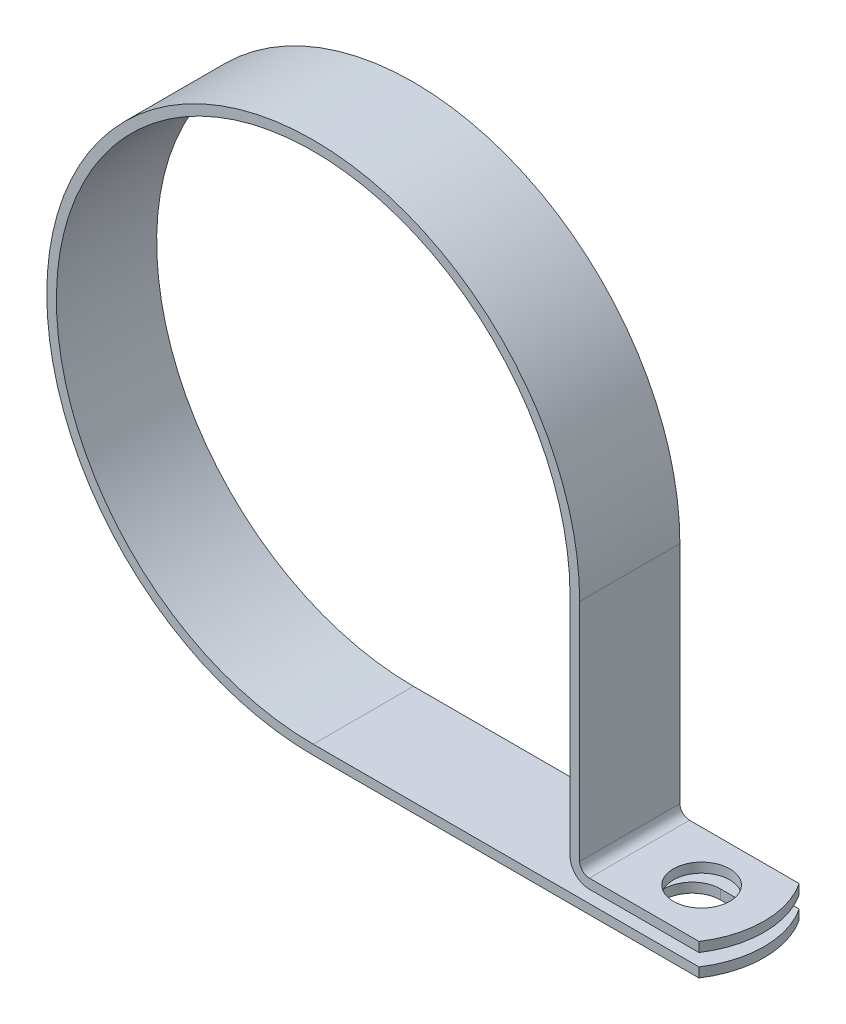
ISO-10303-21;
HEADER;
FILE_DESCRIPTION(('STEP AP214'),'2;1');
FILE_NAME('part.step','',(''),(''),'','','');
FILE_SCHEMA(('AUTOMOTIVE_DESIGN { 1 0 10303 214 1 1 1 1 }'));
ENDSEC;
DATA;
#1=APPLICATION_CONTEXT('core data for automotive mechanical design processes');
#2=APPLICATION_PROTOCOL_DEFINITION('international standard','automotive_design',2000,#1);
#3=PRODUCT_CONTEXT('',#1,'mechanical');
#4=PRODUCT('Part','Part','',(#3));
#5=PRODUCT_RELATED_PRODUCT_CATEGORY('part','',(#4));
#6=PRODUCT_DEFINITION_FORMATION('','',#4);
#7=PRODUCT_DEFINITION_CONTEXT('part definition',#1,'design');
#8=PRODUCT_DEFINITION('design','',#6,#7);
#9=PRODUCT_DEFINITION_SHAPE('','',#8);
#10=(LENGTH_UNIT() NAMED_UNIT(*) SI_UNIT(.MILLI.,.METRE.));
#11=(NAMED_UNIT(*) PLANE_ANGLE_UNIT() SI_UNIT($,.RADIAN.));
#12=(NAMED_UNIT(*) SI_UNIT($,.STERADIAN.) SOLID_ANGLE_UNIT());
#13=UNCERTAINTY_MEASURE_WITH_UNIT(LENGTH_MEASURE(1.E-05),#10,'distance_accuracy_value','');
#14=(GEOMETRIC_REPRESENTATION_CONTEXT(3) GLOBAL_UNCERTAINTY_ASSIGNED_CONTEXT((#13)) GLOBAL_UNIT_ASSIGNED_CONTEXT((#10,
#11,#12)) REPRESENTATION_CONTEXT('',''));
#15=CARTESIAN_POINT('',(0.,0.,0.));
#16=DIRECTION('',(0.,0.,1.));
#17=DIRECTION('',(1.,0.,0.));
#18=AXIS2_PLACEMENT_3D('',#15,#16,#17);
#19=CARTESIAN_POINT('',(39.2514666666582,174.896848604333,0.));
#20=DIRECTION('',(0.,-1.,0.));
#21=DIRECTION('',(0.,0.,-1.));
#22=AXIS2_PLACEMENT_3D('',#19,#20,#21);
#23=CYLINDRICAL_SURFACE('',#22,11.5358333333342);
#24=DIRECTION('',(0.,-1.,0.));
#25=VECTOR('',#24,1.);
#26=CARTESIAN_POINT('',(48.8822999999948,174.896848604333,-6.34999999999657));
#27=LINE('',#26,#25);
#28=CARTESIAN_POINT('',(48.8822999999937,-30.96895,-6.34999999999829));
#29=VERTEX_POINT('',#28);
#30=CARTESIAN_POINT('',(48.8822999999937,-29.74975,-6.34999999999829));
#31=VERTEX_POINT('',#30);
#32=EDGE_CURVE('E126',#29,#31,#27,.F.);
#33=ORIENTED_EDGE('',*,*,#32,.T.);
#34=CARTESIAN_POINT('',(39.2514666666582,-29.74975,0.));
#35=DIRECTION('',(0.,-1.,0.));
#36=DIRECTION('',(0.,0.,-1.));
#37=AXIS2_PLACEMENT_3D('',#34,#35,#36);
#38=CIRCLE('',#37,11.5358333333342);
#39=CARTESIAN_POINT('',(48.8822999999937,-29.74975,6.34999999999829));
#40=VERTEX_POINT('',#39);
#41=EDGE_CURVE('E19',#31,#40,#38,.T.);
#42=ORIENTED_EDGE('',*,*,#41,.T.);
#43=DIRECTION('',(0.,-1.,0.));
#44=VECTOR('',#43,1.);
#45=CARTESIAN_POINT('',(48.8822999999948,174.896848604333,6.34999999999658));
#46=LINE('',#45,#44);
#47=CARTESIAN_POINT('',(48.8822999999937,-30.96895,6.34999999999829));
#48=VERTEX_POINT('',#47);
#49=EDGE_CURVE('E134',#40,#48,#46,.T.);
#50=ORIENTED_EDGE('',*,*,#49,.T.);
#51=CARTESIAN_POINT('',(39.2514666666582,-30.96895,0.));
#52=DIRECTION('',(0.,-1.,0.));
#53=DIRECTION('',(0.,0.,-1.));
#54=AXIS2_PLACEMENT_3D('',#51,#52,#53);
#55=CIRCLE('',#54,11.5358333333342);
#56=EDGE_CURVE('E130',#48,#29,#55,.F.);
#57=ORIENTED_EDGE('',*,*,#56,.T.);
#58=EDGE_LOOP('',(#33,#42,#50,#57));
#59=FACE_BOUND('',#58,.T.);
#60=ADVANCED_FACE('F16',(#59),#23,.T.);
#61=CARTESIAN_POINT('',(42.8625,-33.76295,0.));
#62=DIRECTION('',(0.,1.,0.));
#63=DIRECTION('',(0.,0.,1.));
#64=AXIS2_PLACEMENT_3D('',#61,#62,#63);
#65=CYLINDRICAL_SURFACE('',#64,3.571875);
#66=CARTESIAN_POINT('',(42.8625,-29.74975,0.));
#67=DIRECTION('',(0.,1.,0.));
#68=DIRECTION('',(0.,0.,1.));
#69=AXIS2_PLACEMENT_3D('',#66,#67,#68);
#70=CIRCLE('',#69,3.571875);
#71=CARTESIAN_POINT('',(42.8625,-29.74975,3.571875));
#72=VERTEX_POINT('',#71);
#73=EDGE_CURVE('E142',#72,#72,#70,.T.);
#74=ORIENTED_EDGE('',*,*,#73,.T.);
#75=EDGE_LOOP('',(#74));
#76=FACE_BOUND('',#75,.T.);
#77=CARTESIAN_POINT('',(42.8625,-30.96895,0.));
#78=DIRECTION('',(0.,1.,0.));
#79=DIRECTION('',(0.,0.,1.));
#80=AXIS2_PLACEMENT_3D('',#77,#78,#79);
#81=CIRCLE('',#80,3.571875);
#82=CARTESIAN_POINT('',(42.8625,-30.96895,3.571875));
#83=VERTEX_POINT('',#82);
#84=EDGE_CURVE('E205',#83,#83,#81,.F.);
#85=ORIENTED_EDGE('',*,*,#84,.T.);
#86=EDGE_LOOP('',(#85));
#87=FACE_BOUND('',#86,.T.);
#88=ADVANCED_FACE('F244',(#76,#87),#65,.F.);
#89=CARTESIAN_POINT('',(34.98215,-29.74975,6.35));
#90=DIRECTION('',(0.,-1.,0.));
#91=DIRECTION('',(0.,0.,-1.));
#92=AXIS2_PLACEMENT_3D('',#89,#90,#91);
#93=PLANE('',#92);
#94=ORIENTED_EDGE('',*,*,#73,.F.);
#95=EDGE_LOOP('',(#94));
#96=FACE_BOUND('',#95,.T.);
#97=DIRECTION('',(-1.,0.,0.));
#98=VECTOR('',#97,1.);
#99=CARTESIAN_POINT('',(34.98215,-29.74975,-6.35));
#100=LINE('',#99,#98);
#101=CARTESIAN_POINT('',(34.98215,-29.74975,-6.35));
#102=VERTEX_POINT('',#101);
#103=EDGE_CURVE('E138',#102,#31,#100,.F.);
#104=ORIENTED_EDGE('',*,*,#103,.F.);
#105=DIRECTION('',(0.,0.,-1.));
#106=VECTOR('',#105,1.);
#107=CARTESIAN_POINT('',(34.98215,-29.74975,6.35));
#108=LINE('',#107,#106);
#109=CARTESIAN_POINT('',(34.98215,-29.74975,6.35));
#110=VERTEX_POINT('',#109);
#111=EDGE_CURVE('E192',#102,#110,#108,.F.);
#112=ORIENTED_EDGE('',*,*,#111,.T.);
#113=DIRECTION('',(-1.,0.,0.));
#114=VECTOR('',#113,1.);
#115=CARTESIAN_POINT('',(34.98215,-29.74975,6.35));
#116=LINE('',#115,#114);
#117=EDGE_CURVE('E141',#110,#40,#116,.F.);
#118=ORIENTED_EDGE('',*,*,#117,.T.);
#119=ORIENTED_EDGE('',*,*,#41,.F.);
#120=EDGE_LOOP('',(#104,#112,#118,#119));
#121=FACE_BOUND('',#120,.T.);
#122=ADVANCED_FACE('F137',(#96,#121),#93,.F.);
#123=CARTESIAN_POINT('',(34.98215,-30.96895,6.35));
#124=DIRECTION('',(0.,1.,0.));
#125=DIRECTION('',(0.,0.,1.));
#126=AXIS2_PLACEMENT_3D('',#123,#124,#125);
#127=PLANE('',#126);
#128=ORIENTED_EDGE('',*,*,#84,.F.);
#129=EDGE_LOOP('',(#128));
#130=FACE_BOUND('',#129,.T.);
#131=DIRECTION('',(-1.,0.,0.));
#132=VECTOR('',#131,1.);
#133=CARTESIAN_POINT('',(34.98215,-30.96895,6.35));
#134=LINE('',#133,#132);
#135=CARTESIAN_POINT('',(34.98215,-30.96895,6.35));
#136=VERTEX_POINT('',#135);
#137=EDGE_CURVE('E170',#48,#136,#134,.T.);
#138=ORIENTED_EDGE('',*,*,#137,.T.);
#139=DIRECTION('',(0.,0.,-1.));
#140=VECTOR('',#139,1.);
#141=CARTESIAN_POINT('',(34.98215,-30.96895,6.35));
#142=LINE('',#141,#140);
#143=CARTESIAN_POINT('',(34.98215,-30.96895,-6.35));
#144=VERTEX_POINT('',#143);
#145=EDGE_CURVE('E202',#144,#136,#142,.F.);
#146=ORIENTED_EDGE('',*,*,#145,.F.);
#147=DIRECTION('',(-1.,0.,0.));
#148=VECTOR('',#147,1.);
#149=CARTESIAN_POINT('',(34.98215,-30.96895,-6.35));
#150=LINE('',#149,#148);
#151=EDGE_CURVE('E148',#29,#144,#150,.T.);
#152=ORIENTED_EDGE('',*,*,#151,.F.);
#153=ORIENTED_EDGE('',*,*,#56,.F.);
#154=EDGE_LOOP('',(#138,#146,#152,#153));
#155=FACE_BOUND('',#154,.T.);
#156=ADVANCED_FACE('F248',(#130,#155),#127,.F.);
#157=CARTESIAN_POINT('',(34.98215,-28.53055,6.35));
#158=DIRECTION('',(0.,0.,-1.));
#159=DIRECTION('',(-1.,0.,0.));
#160=AXIS2_PLACEMENT_3D('',#157,#158,#159);
#161=CYLINDRICAL_SURFACE('',#160,2.4384);
#162=CARTESIAN_POINT('',(34.98215,-28.53055,6.35));
#163=DIRECTION('',(0.,0.,-1.));
#164=DIRECTION('',(-1.,0.,0.));
#165=AXIS2_PLACEMENT_3D('',#162,#163,#164);
#166=CIRCLE('',#165,2.4384);
#167=CARTESIAN_POINT('',(32.54375,-28.53055,6.35));
#168=VERTEX_POINT('',#167);
#169=EDGE_CURVE('E169',#136,#168,#166,.T.);
#170=ORIENTED_EDGE('',*,*,#169,.T.);
#171=DIRECTION('',(0.,0.,-1.));
#172=VECTOR('',#171,1.);
#173=CARTESIAN_POINT('',(32.54375,-28.53055,6.35));
#174=LINE('',#173,#172);
#175=CARTESIAN_POINT('',(32.54375,-28.53055,-6.35));
#176=VERTEX_POINT('',#175);
#177=EDGE_CURVE('E200',#168,#176,#174,.T.);
#178=ORIENTED_EDGE('',*,*,#177,.T.);
#179=CARTESIAN_POINT('',(34.98215,-28.53055,-6.35));
#180=DIRECTION('',(0.,0.,-1.));
#181=DIRECTION('',(-1.,0.,0.));
#182=AXIS2_PLACEMENT_3D('',#179,#180,#181);
#183=CIRCLE('',#182,2.4384);
#184=EDGE_CURVE('E151',#144,#176,#183,.T.);
#185=ORIENTED_EDGE('',*,*,#184,.F.);
#186=ORIENTED_EDGE('',*,*,#145,.T.);
#187=EDGE_LOOP('',(#170,#178,#185,#186));
#188=FACE_BOUND('',#187,.T.);
#189=ADVANCED_FACE('F255',(#188),#161,.T.);
#190=CARTESIAN_POINT('',(32.54375,0.,6.35));
#191=DIRECTION('',(1.,0.,0.));
#192=DIRECTION('',(0.,0.,-1.));
#193=AXIS2_PLACEMENT_3D('',#190,#191,#192);
#194=PLANE('',#193);
#195=ORIENTED_EDGE('',*,*,#177,.F.);
#196=DIRECTION('',(0.,1.,0.));
#197=VECTOR('',#196,1.);
#198=CARTESIAN_POINT('',(32.54375,-28.53055,6.35));
#199=LINE('',#198,#197);
#200=CARTESIAN_POINT('',(32.54375,0.,6.35));
#201=VERTEX_POINT('',#200);
#202=EDGE_CURVE('E167',#168,#201,#199,.T.);
#203=ORIENTED_EDGE('',*,*,#202,.T.);
#204=DIRECTION('',(0.,0.,-1.));
#205=VECTOR('',#204,1.);
#206=CARTESIAN_POINT('',(32.54375,0.,6.35));
#207=LINE('',#206,#205);
#208=CARTESIAN_POINT('',(32.54375,0.,-6.35));
#209=VERTEX_POINT('',#208);
#210=EDGE_CURVE('E198',#201,#209,#207,.T.);
#211=ORIENTED_EDGE('',*,*,#210,.T.);
#212=DIRECTION('',(0.,1.,0.));
#213=VECTOR('',#212,1.);
#214=CARTESIAN_POINT('',(32.54375,-28.53055,-6.35));
#215=LINE('',#214,#213);
#216=EDGE_CURVE('E228',#176,#209,#215,.T.);
#217=ORIENTED_EDGE('',*,*,#216,.F.);
#218=EDGE_LOOP('',(#195,#203,#211,#217));
#219=FACE_BOUND('',#218,.T.);
#220=ADVANCED_FACE('F310',(#219),#194,.F.);
#221=CARTESIAN_POINT('',(0.,0.,6.35));
#222=DIRECTION('',(0.,0.,-1.));
#223=DIRECTION('',(-1.,0.,0.));
#224=AXIS2_PLACEMENT_3D('',#221,#222,#223);
#225=CYLINDRICAL_SURFACE('',#224,32.54375);
#226=DIRECTION('',(0.,0.,-1.));
#227=VECTOR('',#226,1.);
#228=CARTESIAN_POINT('',(0.,-32.54375,6.35));
#229=LINE('',#228,#227);
#230=CARTESIAN_POINT('',(0.,-32.54375,6.35));
#231=VERTEX_POINT('',#230);
#232=CARTESIAN_POINT('',(0.,-32.54375,-6.35));
#233=VERTEX_POINT('',#232);
#234=EDGE_CURVE('E195',#231,#233,#229,.T.);
#235=ORIENTED_EDGE('',*,*,#234,.T.);
#236=CARTESIAN_POINT('',(0.,0.,-6.35));
#237=DIRECTION('',(0.,0.,-1.));
#238=DIRECTION('',(-1.,0.,0.));
#239=AXIS2_PLACEMENT_3D('',#236,#237,#238);
#240=CIRCLE('',#239,32.54375);
#241=EDGE_CURVE('E225',#209,#233,#240,.F.);
#242=ORIENTED_EDGE('',*,*,#241,.F.);
#243=ORIENTED_EDGE('',*,*,#210,.F.);
#244=CARTESIAN_POINT('',(0.,0.,6.35));
#245=DIRECTION('',(0.,0.,-1.));
#246=DIRECTION('',(-1.,0.,0.));
#247=AXIS2_PLACEMENT_3D('',#244,#245,#246);
#248=CIRCLE('',#247,32.54375);
#249=EDGE_CURVE('E166',#201,#231,#248,.F.);
#250=ORIENTED_EDGE('',*,*,#249,.T.);
#251=EDGE_LOOP('',(#235,#242,#243,#250));
#252=FACE_BOUND('',#251,.T.);
#253=ADVANCED_FACE('F306',(#252),#225,.F.);
#254=CARTESIAN_POINT('',(0.,-32.54375,6.35));
#255=DIRECTION('',(0.,-1.,0.));
#256=DIRECTION('',(0.,0.,-1.));
#257=AXIS2_PLACEMENT_3D('',#254,#255,#256);
#258=PLANE('',#257);
#259=DIRECTION('',(1.,0.,0.));
#260=VECTOR('',#259,1.);
#261=CARTESIAN_POINT('',(41.671875,-32.54375,3.571875));
#262=LINE('',#261,#260);
#263=CARTESIAN_POINT('',(44.053125,-32.54375,3.571875));
#264=VERTEX_POINT('',#263);
#265=CARTESIAN_POINT('',(41.671875,-32.54375,3.571875));
#266=VERTEX_POINT('',#265);
#267=EDGE_CURVE('E182',#264,#266,#262,.F.);
#268=ORIENTED_EDGE('',*,*,#267,.T.);
#269=CARTESIAN_POINT('',(41.671875,-32.54375,0.));
#270=DIRECTION('',(0.,-1.,0.));
#271=DIRECTION('',(0.,0.,-1.));
#272=AXIS2_PLACEMENT_3D('',#269,#270,#271);
#273=CIRCLE('',#272,3.571875);
#274=CARTESIAN_POINT('',(41.671875,-32.54375,-3.571875));
#275=VERTEX_POINT('',#274);
#276=EDGE_CURVE('E178',#266,#275,#273,.T.);
#277=ORIENTED_EDGE('',*,*,#276,.T.);
#278=DIRECTION('',(-1.,0.,0.));
#279=VECTOR('',#278,1.);
#280=CARTESIAN_POINT('',(41.671875,-32.54375,-3.571875));
#281=LINE('',#280,#279);
#282=CARTESIAN_POINT('',(44.053125,-32.54375,-3.571875));
#283=VERTEX_POINT('',#282);
#284=EDGE_CURVE('E172',#275,#283,#281,.F.);
#285=ORIENTED_EDGE('',*,*,#284,.T.);
#286=CARTESIAN_POINT('',(44.053125,-32.54375,0.));
#287=DIRECTION('',(0.,-1.,0.));
#288=DIRECTION('',(0.,0.,-1.));
#289=AXIS2_PLACEMENT_3D('',#286,#287,#288);
#290=CIRCLE('',#289,3.571875);
#291=EDGE_CURVE('E186',#283,#264,#290,.T.);
#292=ORIENTED_EDGE('',*,*,#291,.T.);
#293=EDGE_LOOP('',(#268,#277,#285,#292));
#294=FACE_BOUND('',#293,.T.);
#295=DIRECTION('',(-1.,0.,0.));
#296=VECTOR('',#295,1.);
#297=CARTESIAN_POINT('',(34.98215,-32.54375,-6.35));
#298=LINE('',#297,#296);
#299=CARTESIAN_POINT('',(48.8822999999963,-32.54375,-6.35));
#300=VERTEX_POINT('',#299);
#301=EDGE_CURVE('E191',#233,#300,#298,.F.);
#302=ORIENTED_EDGE('',*,*,#301,.F.);
#303=ORIENTED_EDGE('',*,*,#234,.F.);
#304=DIRECTION('',(-1.,0.,0.));
#305=VECTOR('',#304,1.);
#306=CARTESIAN_POINT('',(34.98215,-32.54375,6.35));
#307=LINE('',#306,#305);
#308=CARTESIAN_POINT('',(48.8822999999963,-32.54375,6.35));
#309=VERTEX_POINT('',#308);
#310=EDGE_CURVE('E163',#231,#309,#307,.F.);
#311=ORIENTED_EDGE('',*,*,#310,.T.);
#312=CARTESIAN_POINT('',(39.2514666666582,-32.54375,0.));
#313=DIRECTION('',(0.,-1.,0.));
#314=DIRECTION('',(0.,0.,-1.));
#315=AXIS2_PLACEMENT_3D('',#312,#313,#314);
#316=CIRCLE('',#315,11.5358333333342);
#317=EDGE_CURVE('E194',#300,#309,#316,.T.);
#318=ORIENTED_EDGE('',*,*,#317,.F.);
#319=EDGE_LOOP('',(#302,#303,#311,#318));
#320=FACE_BOUND('',#319,.T.);
#321=ADVANCED_FACE('F302',(#294,#320),#258,.F.);
#322=CARTESIAN_POINT('',(34.98215,-28.53055,6.35));
#323=DIRECTION('',(0.,0.,-1.));
#324=DIRECTION('',(-1.,0.,0.));
#325=AXIS2_PLACEMENT_3D('',#322,#323,#324);
#326=CYLINDRICAL_SURFACE('',#325,1.2192);
#327=DIRECTION('',(0.,0.,1.));
#328=VECTOR('',#327,1.);
#329=CARTESIAN_POINT('',(33.76295,-28.53055,6.35));
#330=LINE('',#329,#328);
#331=CARTESIAN_POINT('',(33.76295,-28.53055,-6.35));
#332=VERTEX_POINT('',#331);
#333=CARTESIAN_POINT('',(33.76295,-28.53055,6.35));
#334=VERTEX_POINT('',#333);
#335=EDGE_CURVE('E153',#332,#334,#330,.T.);
#336=ORIENTED_EDGE('',*,*,#335,.T.);
#337=CARTESIAN_POINT('',(34.98215,-28.53055,6.35));
#338=DIRECTION('',(0.,0.,-1.));
#339=DIRECTION('',(-1.,0.,0.));
#340=AXIS2_PLACEMENT_3D('',#337,#338,#339);
#341=CIRCLE('',#340,1.2192);
#342=EDGE_CURVE('E162',#334,#110,#341,.F.);
#343=ORIENTED_EDGE('',*,*,#342,.T.);
#344=ORIENTED_EDGE('',*,*,#111,.F.);
#345=CARTESIAN_POINT('',(34.98215,-28.53055,-6.35));
#346=DIRECTION('',(0.,0.,-1.));
#347=DIRECTION('',(-1.,0.,0.));
#348=AXIS2_PLACEMENT_3D('',#345,#346,#347);
#349=CIRCLE('',#348,1.2192);
#350=EDGE_CURVE('E147',#332,#102,#349,.F.);
#351=ORIENTED_EDGE('',*,*,#350,.F.);
#352=EDGE_LOOP('',(#336,#343,#344,#351));
#353=FACE_BOUND('',#352,.T.);
#354=ADVANCED_FACE('F298',(#353),#326,.F.);
#355=CARTESIAN_POINT('',(39.2514666666582,174.896848604333,0.));
#356=DIRECTION('',(0.,-1.,0.));
#357=DIRECTION('',(0.,0.,-1.));
#358=AXIS2_PLACEMENT_3D('',#355,#356,#357);
#359=CYLINDRICAL_SURFACE('',#358,11.5358333333342);
#360=DIRECTION('',(0.,1.,0.));
#361=VECTOR('',#360,1.);
#362=CARTESIAN_POINT('',(48.8823,-28.53055,-6.35));
#363=LINE('',#362,#361);
#364=CARTESIAN_POINT('',(48.8822999999963,-33.76295,-6.35));
#365=VERTEX_POINT('',#364);
#366=EDGE_CURVE('E188',#300,#365,#363,.F.);
#367=ORIENTED_EDGE('',*,*,#366,.F.);
#368=ORIENTED_EDGE('',*,*,#317,.T.);
#369=DIRECTION('',(0.,1.,0.));
#370=VECTOR('',#369,1.);
#371=CARTESIAN_POINT('',(48.8823,-28.53055,6.35));
#372=LINE('',#371,#370);
#373=CARTESIAN_POINT('',(48.8822999999963,-33.76295,6.35));
#374=VERTEX_POINT('',#373);
#375=EDGE_CURVE('E165',#309,#374,#372,.F.);
#376=ORIENTED_EDGE('',*,*,#375,.T.);
#377=CARTESIAN_POINT('',(39.2514666666582,-33.76295,0.));
#378=DIRECTION('',(0.,-1.,0.));
#379=DIRECTION('',(0.,0.,-1.));
#380=AXIS2_PLACEMENT_3D('',#377,#378,#379);
#381=CIRCLE('',#380,11.5358333333342);
#382=EDGE_CURVE('E220',#374,#365,#381,.F.);
#383=ORIENTED_EDGE('',*,*,#382,.T.);
#384=EDGE_LOOP('',(#367,#368,#376,#383));
#385=FACE_BOUND('',#384,.T.);
#386=ADVANCED_FACE('F294',(#385),#359,.T.);
#387=CARTESIAN_POINT('',(44.053125,-20.6375,0.));
#388=DIRECTION('',(0.,-1.,0.));
#389=DIRECTION('',(0.,0.,-1.));
#390=AXIS2_PLACEMENT_3D('',#387,#388,#389);
#391=CYLINDRICAL_SURFACE('',#390,3.571875);
#392=DIRECTION('',(0.,1.,0.));
#393=VECTOR('',#392,1.);
#394=CARTESIAN_POINT('',(44.053125,-20.6375,-3.571875));
#395=LINE('',#394,#393);
#396=CARTESIAN_POINT('',(44.053125,-33.76295,-3.571875));
#397=VERTEX_POINT('',#396);
#398=EDGE_CURVE('E176',#283,#397,#395,.F.);
#399=ORIENTED_EDGE('',*,*,#398,.T.);
#400=CARTESIAN_POINT('',(44.053125,-33.76295,0.));
#401=DIRECTION('',(0.,-1.,0.));
#402=DIRECTION('',(0.,0.,-1.));
#403=AXIS2_PLACEMENT_3D('',#400,#401,#402);
#404=CIRCLE('',#403,3.571875);
#405=CARTESIAN_POINT('',(44.053125,-33.76295,3.571875));
#406=VERTEX_POINT('',#405);
#407=EDGE_CURVE('E218',#397,#406,#404,.T.);
#408=ORIENTED_EDGE('',*,*,#407,.T.);
#409=DIRECTION('',(0.,1.,0.));
#410=VECTOR('',#409,1.);
#411=CARTESIAN_POINT('',(44.053125,-20.6375,3.571875));
#412=LINE('',#411,#410);
#413=EDGE_CURVE('E183',#406,#264,#412,.T.);
#414=ORIENTED_EDGE('',*,*,#413,.T.);
#415=ORIENTED_EDGE('',*,*,#291,.F.);
#416=EDGE_LOOP('',(#399,#408,#414,#415));
#417=FACE_BOUND('',#416,.T.);
#418=ADVANCED_FACE('F290',(#417),#391,.F.);
#419=CARTESIAN_POINT('',(41.671875,-20.6375,3.571875));
#420=DIRECTION('',(0.,0.,1.));
#421=DIRECTION('',(1.,0.,0.));
#422=AXIS2_PLACEMENT_3D('',#419,#420,#421);
#423=PLANE('',#422);
#424=ORIENTED_EDGE('',*,*,#413,.F.);
#425=DIRECTION('',(1.,0.,0.));
#426=VECTOR('',#425,1.);
#427=CARTESIAN_POINT('',(0.,-33.76295,3.571875));
#428=LINE('',#427,#426);
#429=CARTESIAN_POINT('',(41.671875,-33.76295,3.571875));
#430=VERTEX_POINT('',#429);
#431=EDGE_CURVE('E217',#406,#430,#428,.F.);
#432=ORIENTED_EDGE('',*,*,#431,.T.);
#433=DIRECTION('',(0.,-1.,0.));
#434=VECTOR('',#433,1.);
#435=CARTESIAN_POINT('',(41.671875,-20.6375,3.571875));
#436=LINE('',#435,#434);
#437=EDGE_CURVE('E179',#430,#266,#436,.F.);
#438=ORIENTED_EDGE('',*,*,#437,.T.);
#439=ORIENTED_EDGE('',*,*,#267,.F.);
#440=EDGE_LOOP('',(#424,#432,#438,#439));
#441=FACE_BOUND('',#440,.T.);
#442=ADVANCED_FACE('F286',(#441),#423,.F.);
#443=CARTESIAN_POINT('',(41.671875,-20.6375,0.));
#444=DIRECTION('',(0.,-1.,0.));
#445=DIRECTION('',(0.,0.,-1.));
#446=AXIS2_PLACEMENT_3D('',#443,#444,#445);
#447=CYLINDRICAL_SURFACE('',#446,3.571875);
#448=ORIENTED_EDGE('',*,*,#437,.F.);
#449=CARTESIAN_POINT('',(41.671875,-33.76295,0.));
#450=DIRECTION('',(0.,-1.,0.));
#451=DIRECTION('',(0.,0.,-1.));
#452=AXIS2_PLACEMENT_3D('',#449,#450,#451);
#453=CIRCLE('',#452,3.571875);
#454=CARTESIAN_POINT('',(41.671875,-33.76295,-3.571875));
#455=VERTEX_POINT('',#454);
#456=EDGE_CURVE('E215',#430,#455,#453,.T.);
#457=ORIENTED_EDGE('',*,*,#456,.T.);
#458=DIRECTION('',(0.,1.,0.));
#459=VECTOR('',#458,1.);
#460=CARTESIAN_POINT('',(41.671875,-20.6375,-3.571875));
#461=LINE('',#460,#459);
#462=EDGE_CURVE('E173',#455,#275,#461,.T.);
#463=ORIENTED_EDGE('',*,*,#462,.T.);
#464=ORIENTED_EDGE('',*,*,#276,.F.);
#465=EDGE_LOOP('',(#448,#457,#463,#464));
#466=FACE_BOUND('',#465,.T.);
#467=ADVANCED_FACE('F282',(#466),#447,.F.);
#468=CARTESIAN_POINT('',(41.671875,-20.6375,-3.571875));
#469=DIRECTION('',(0.,0.,-1.));
#470=DIRECTION('',(-1.,0.,0.));
#471=AXIS2_PLACEMENT_3D('',#468,#469,#470);
#472=PLANE('',#471);
#473=ORIENTED_EDGE('',*,*,#462,.F.);
#474=DIRECTION('',(1.,0.,0.));
#475=VECTOR('',#474,1.);
#476=CARTESIAN_POINT('',(0.,-33.76295,-3.571875));
#477=LINE('',#476,#475);
#478=EDGE_CURVE('E214',#455,#397,#477,.T.);
#479=ORIENTED_EDGE('',*,*,#478,.T.);
#480=ORIENTED_EDGE('',*,*,#398,.F.);
#481=ORIENTED_EDGE('',*,*,#284,.F.);
#482=EDGE_LOOP('',(#473,#479,#480,#481));
#483=FACE_BOUND('',#482,.T.);
#484=ADVANCED_FACE('F278',(#483),#472,.F.);
#485=CARTESIAN_POINT('',(34.98215,-28.53055,6.35));
#486=DIRECTION('',(0.,0.,-1.));
#487=DIRECTION('',(-1.,0.,0.));
#488=AXIS2_PLACEMENT_3D('',#485,#486,#487);
#489=PLANE('',#488);
#490=ORIENTED_EDGE('',*,*,#117,.F.);
#491=ORIENTED_EDGE('',*,*,#342,.F.);
#492=DIRECTION('',(0.,1.,0.));
#493=VECTOR('',#492,1.);
#494=CARTESIAN_POINT('',(33.76295,0.,6.35));
#495=LINE('',#494,#493);
#496=CARTESIAN_POINT('',(33.76295,0.,6.35));
#497=VERTEX_POINT('',#496);
#498=EDGE_CURVE('E149',#334,#497,#495,.T.);
#499=ORIENTED_EDGE('',*,*,#498,.T.);
#500=CARTESIAN_POINT('',(0.,0.,6.35));
#501=DIRECTION('',(0.,0.,-1.));
#502=DIRECTION('',(-1.,0.,0.));
#503=AXIS2_PLACEMENT_3D('',#500,#501,#502);
#504=CIRCLE('',#503,33.76295);
#505=CARTESIAN_POINT('',(0.,-33.76295,6.35));
#506=VERTEX_POINT('',#505);
#507=EDGE_CURVE('E159',#506,#497,#504,.T.);
#508=ORIENTED_EDGE('',*,*,#507,.F.);
#509=DIRECTION('',(1.,0.,0.));
#510=VECTOR('',#509,1.);
#511=CARTESIAN_POINT('',(0.,-33.76295,6.35));
#512=LINE('',#511,#510);
#513=EDGE_CURVE('E223',#506,#374,#512,.T.);
#514=ORIENTED_EDGE('',*,*,#513,.T.);
#515=ORIENTED_EDGE('',*,*,#375,.F.);
#516=ORIENTED_EDGE('',*,*,#310,.F.);
#517=ORIENTED_EDGE('',*,*,#249,.F.);
#518=ORIENTED_EDGE('',*,*,#202,.F.);
#519=ORIENTED_EDGE('',*,*,#169,.F.);
#520=ORIENTED_EDGE('',*,*,#137,.F.);
#521=ORIENTED_EDGE('',*,*,#49,.F.);
#522=EDGE_LOOP('',(#490,#491,#499,#508,#514,#515,#516,#517,#518,#519,#520,#521));
#523=FACE_BOUND('',#522,.T.);
#524=ADVANCED_FACE('F274',(#523),#489,.F.);
#525=CARTESIAN_POINT('',(33.76295,0.,6.35));
#526=DIRECTION('',(-1.,0.,0.));
#527=DIRECTION('',(0.,0.,1.));
#528=AXIS2_PLACEMENT_3D('',#525,#526,#527);
#529=PLANE('',#528);
#530=DIRECTION('',(0.,0.,-1.));
#531=VECTOR('',#530,1.);
#532=CARTESIAN_POINT('',(33.76295,0.,6.35));
#533=LINE('',#532,#531);
#534=CARTESIAN_POINT('',(33.76295,0.,-6.35));
#535=VERTEX_POINT('',#534);
#536=EDGE_CURVE('E157',#497,#535,#533,.T.);
#537=ORIENTED_EDGE('',*,*,#536,.F.);
#538=ORIENTED_EDGE('',*,*,#498,.F.);
#539=ORIENTED_EDGE('',*,*,#335,.F.);
#540=DIRECTION('',(0.,1.,0.));
#541=VECTOR('',#540,1.);
#542=CARTESIAN_POINT('',(33.76295,-28.53055,-6.35));
#543=LINE('',#542,#541);
#544=EDGE_CURVE('E190',#535,#332,#543,.F.);
#545=ORIENTED_EDGE('',*,*,#544,.F.);
#546=EDGE_LOOP('',(#537,#538,#539,#545));
#547=FACE_BOUND('',#546,.T.);
#548=ADVANCED_FACE('F271',(#547),#529,.F.);
#549=CARTESIAN_POINT('',(34.98215,-28.53055,-6.35));
#550=DIRECTION('',(0.,0.,-1.));
#551=DIRECTION('',(-1.,0.,0.));
#552=AXIS2_PLACEMENT_3D('',#549,#550,#551);
#553=PLANE('',#552);
#554=ORIENTED_EDGE('',*,*,#544,.T.);
#555=ORIENTED_EDGE('',*,*,#350,.T.);
#556=ORIENTED_EDGE('',*,*,#103,.T.);
#557=ORIENTED_EDGE('',*,*,#32,.F.);
#558=ORIENTED_EDGE('',*,*,#151,.T.);
#559=ORIENTED_EDGE('',*,*,#184,.T.);
#560=ORIENTED_EDGE('',*,*,#216,.T.);
#561=ORIENTED_EDGE('',*,*,#241,.T.);
#562=ORIENTED_EDGE('',*,*,#301,.T.);
#563=ORIENTED_EDGE('',*,*,#366,.T.);
#564=DIRECTION('',(1.,0.,0.));
#565=VECTOR('',#564,1.);
#566=CARTESIAN_POINT('',(0.,-33.76295,-6.35));
#567=LINE('',#566,#565);
#568=CARTESIAN_POINT('',(0.,-33.76295,-6.35));
#569=VERTEX_POINT('',#568);
#570=EDGE_CURVE('E34',#365,#569,#567,.F.);
#571=ORIENTED_EDGE('',*,*,#570,.T.);
#572=CARTESIAN_POINT('',(0.,0.,-6.35));
#573=DIRECTION('',(0.,0.,-1.));
#574=DIRECTION('',(-1.,0.,0.));
#575=AXIS2_PLACEMENT_3D('',#572,#573,#574);
#576=CIRCLE('',#575,33.76295);
#577=EDGE_CURVE('E25',#535,#569,#576,.F.);
#578=ORIENTED_EDGE('',*,*,#577,.F.);
#579=EDGE_LOOP('',(#554,#555,#556,#557,#558,#559,#560,#561,#562,#563,#571,#578));
#580=FACE_BOUND('',#579,.T.);
#581=ADVANCED_FACE('F145',(#580),#553,.T.);
#582=CARTESIAN_POINT('',(0.,-33.76295,6.35));
#583=DIRECTION('',(0.,1.,0.));
#584=DIRECTION('',(0.,0.,1.));
#585=AXIS2_PLACEMENT_3D('',#582,#583,#584);
#586=PLANE('',#585);
#587=ORIENTED_EDGE('',*,*,#456,.F.);
#588=ORIENTED_EDGE('',*,*,#431,.F.);
#589=ORIENTED_EDGE('',*,*,#407,.F.);
#590=ORIENTED_EDGE('',*,*,#478,.F.);
#591=EDGE_LOOP('',(#587,#588,#589,#590));
#592=FACE_BOUND('',#591,.T.);
#593=ORIENTED_EDGE('',*,*,#513,.F.);
#594=DIRECTION('',(0.,0.,-1.));
#595=VECTOR('',#594,1.);
#596=CARTESIAN_POINT('',(0.,-33.76295,6.35));
#597=LINE('',#596,#595);
#598=EDGE_CURVE('E11',#569,#506,#597,.F.);
#599=ORIENTED_EDGE('',*,*,#598,.F.);
#600=ORIENTED_EDGE('',*,*,#570,.F.);
#601=ORIENTED_EDGE('',*,*,#382,.F.);
#602=EDGE_LOOP('',(#593,#599,#600,#601));
#603=FACE_BOUND('',#602,.T.);
#604=ADVANCED_FACE('F260',(#592,#603),#586,.F.);
#605=CARTESIAN_POINT('',(0.,0.,6.35));
#606=DIRECTION('',(0.,0.,-1.));
#607=DIRECTION('',(-1.,0.,0.));
#608=AXIS2_PLACEMENT_3D('',#605,#606,#607);
#609=CYLINDRICAL_SURFACE('',#608,33.76295);
#610=ORIENTED_EDGE('',*,*,#577,.T.);
#611=ORIENTED_EDGE('',*,*,#598,.T.);
#612=ORIENTED_EDGE('',*,*,#507,.T.);
#613=ORIENTED_EDGE('',*,*,#536,.T.);
#614=EDGE_LOOP('',(#610,#611,#612,#613));
#615=FACE_BOUND('',#614,.T.);
#616=ADVANCED_FACE('F258',(#615),#609,.T.);
#617=CLOSED_SHELL('',(#60,#88,#122,#156,#189,#220,#253,#321,#354,#386,#418,#442,#467,#484,#524,
#548,#581,#604,#616));
#618=MANIFOLD_SOLID_BREP('B1',#617);
#619=ADVANCED_BREP_SHAPE_REPRESENTATION('',(#18,#618),#14);
#620=SHAPE_DEFINITION_REPRESENTATION(#9,#619);
ENDSEC;
END-ISO-10303-21;
